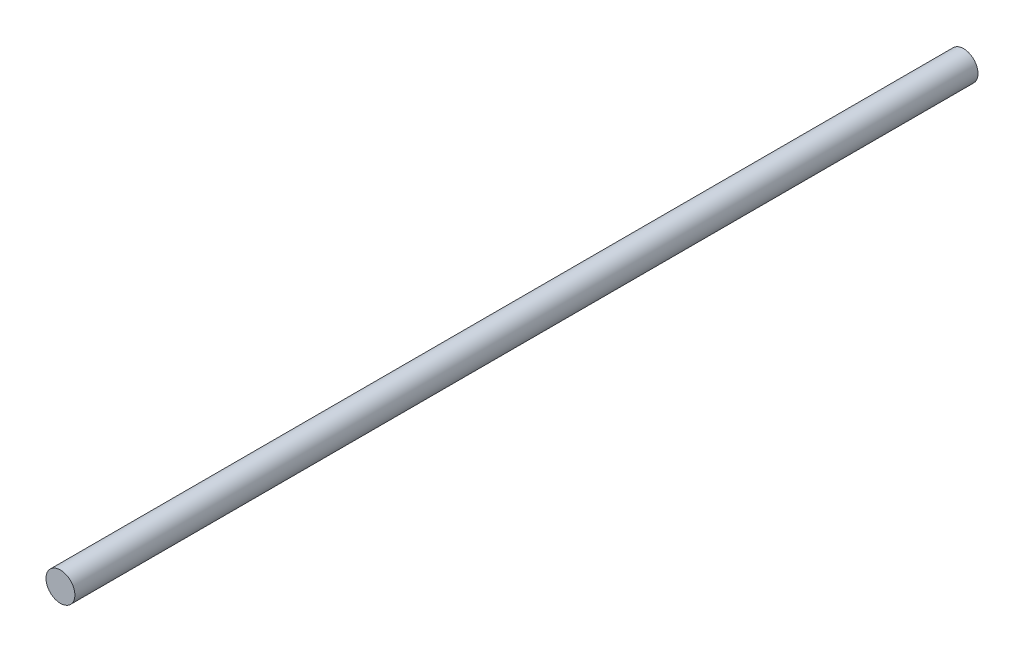
ISO-10303-21;
HEADER;
FILE_DESCRIPTION(('STEP AP214'),'2;1');
FILE_NAME('part.step','',(''),(''),'','','');
FILE_SCHEMA(('AUTOMOTIVE_DESIGN { 1 0 10303 214 1 1 1 1 }'));
ENDSEC;
DATA;
#1=APPLICATION_CONTEXT('core data for automotive mechanical design processes');
#2=APPLICATION_PROTOCOL_DEFINITION('international standard','automotive_design',2000,#1);
#3=PRODUCT_CONTEXT('',#1,'mechanical');
#4=PRODUCT('Part','Part','',(#3));
#5=PRODUCT_RELATED_PRODUCT_CATEGORY('part','',(#4));
#6=PRODUCT_DEFINITION_FORMATION('','',#4);
#7=PRODUCT_DEFINITION_CONTEXT('part definition',#1,'design');
#8=PRODUCT_DEFINITION('design','',#6,#7);
#9=PRODUCT_DEFINITION_SHAPE('','',#8);
#10=(LENGTH_UNIT() NAMED_UNIT(*) SI_UNIT(.MILLI.,.METRE.));
#11=(NAMED_UNIT(*) PLANE_ANGLE_UNIT() SI_UNIT($,.RADIAN.));
#12=(NAMED_UNIT(*) SI_UNIT($,.STERADIAN.) SOLID_ANGLE_UNIT());
#13=UNCERTAINTY_MEASURE_WITH_UNIT(LENGTH_MEASURE(1.E-05),#10,'distance_accuracy_value','');
#14=(GEOMETRIC_REPRESENTATION_CONTEXT(3) GLOBAL_UNCERTAINTY_ASSIGNED_CONTEXT((#13)) GLOBAL_UNIT_ASSIGNED_CONTEXT((#10,
#11,#12)) REPRESENTATION_CONTEXT('',''));
#15=CARTESIAN_POINT('',(0.,0.,0.));
#16=DIRECTION('',(0.,0.,1.));
#17=DIRECTION('',(1.,0.,0.));
#18=AXIS2_PLACEMENT_3D('',#15,#16,#17);
#19=CARTESIAN_POINT('',(0.,0.,250.));
#20=DIRECTION('',(0.,0.,-1.));
#21=DIRECTION('',(-1.,0.,0.));
#22=AXIS2_PLACEMENT_3D('',#19,#20,#21);
#23=CYLINDRICAL_SURFACE('',#22,4.);
#24=CARTESIAN_POINT('',(0.,0.,250.));
#25=DIRECTION('',(0.,0.,1.));
#26=DIRECTION('',(1.,0.,0.));
#27=AXIS2_PLACEMENT_3D('',#24,#25,#26);
#28=CIRCLE('',#27,4.);
#29=CARTESIAN_POINT('',(4.,0.,250.));
#30=VERTEX_POINT('',#29);
#31=EDGE_CURVE('E10',#30,#30,#28,.T.);
#32=ORIENTED_EDGE('',*,*,#31,.F.);
#33=EDGE_LOOP('',(#32));
#34=FACE_BOUND('',#33,.T.);
#35=CARTESIAN_POINT('',(0.,0.,0.));
#36=DIRECTION('',(0.,0.,1.));
#37=DIRECTION('',(1.,0.,0.));
#38=AXIS2_PLACEMENT_3D('',#35,#36,#37);
#39=CIRCLE('',#38,4.);
#40=CARTESIAN_POINT('',(4.,0.,0.));
#41=VERTEX_POINT('',#40);
#42=EDGE_CURVE('E40',#41,#41,#39,.T.);
#43=ORIENTED_EDGE('',*,*,#42,.T.);
#44=EDGE_LOOP('',(#43));
#45=FACE_BOUND('',#44,.T.);
#46=ADVANCED_FACE('F37',(#34,#45),#23,.T.);
#47=CARTESIAN_POINT('',(0.,0.,250.));
#48=DIRECTION('',(0.,0.,1.));
#49=DIRECTION('',(1.,0.,0.));
#50=AXIS2_PLACEMENT_3D('',#47,#48,#49);
#51=PLANE('',#50);
#52=ORIENTED_EDGE('',*,*,#31,.T.);
#53=EDGE_LOOP('',(#52));
#54=FACE_BOUND('',#53,.T.);
#55=ADVANCED_FACE('F52',(#54),#51,.T.);
#56=CARTESIAN_POINT('',(0.,0.,0.));
#57=DIRECTION('',(0.,0.,1.));
#58=DIRECTION('',(1.,0.,0.));
#59=AXIS2_PLACEMENT_3D('',#56,#57,#58);
#60=PLANE('',#59);
#61=ORIENTED_EDGE('',*,*,#42,.F.);
#62=EDGE_LOOP('',(#61));
#63=FACE_BOUND('',#62,.T.);
#64=ADVANCED_FACE('F50',(#63),#60,.F.);
#65=CLOSED_SHELL('',(#46,#55,#64));
#66=MANIFOLD_SOLID_BREP('B2',#65);
#67=ADVANCED_BREP_SHAPE_REPRESENTATION('',(#18,#66),#14);
#68=SHAPE_DEFINITION_REPRESENTATION(#9,#67);
ENDSEC;
END-ISO-10303-21;
